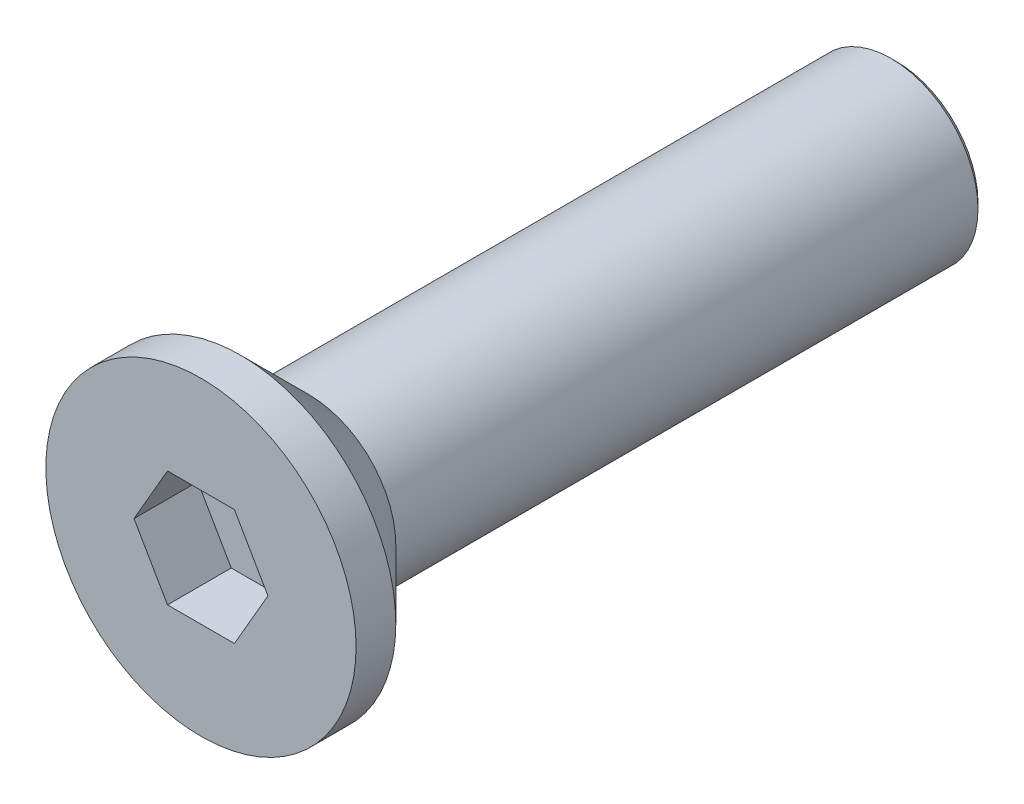
ISO-10303-21;
HEADER;
FILE_DESCRIPTION(('STEP AP214'),'2;1');
FILE_NAME('part.step','',(''),(''),'','','');
FILE_SCHEMA(('AUTOMOTIVE_DESIGN { 1 0 10303 214 1 1 1 1 }'));
ENDSEC;
DATA;
#1=APPLICATION_CONTEXT('core data for automotive mechanical design processes');
#2=APPLICATION_PROTOCOL_DEFINITION('international standard','automotive_design',2000,#1);
#3=PRODUCT_CONTEXT('',#1,'mechanical');
#4=PRODUCT('Part','Part','',(#3));
#5=PRODUCT_RELATED_PRODUCT_CATEGORY('part','',(#4));
#6=PRODUCT_DEFINITION_FORMATION('','',#4);
#7=PRODUCT_DEFINITION_CONTEXT('part definition',#1,'design');
#8=PRODUCT_DEFINITION('design','',#6,#7);
#9=PRODUCT_DEFINITION_SHAPE('','',#8);
#10=(LENGTH_UNIT() NAMED_UNIT(*) SI_UNIT(.MILLI.,.METRE.));
#11=(NAMED_UNIT(*) PLANE_ANGLE_UNIT() SI_UNIT($,.RADIAN.));
#12=(NAMED_UNIT(*) SI_UNIT($,.STERADIAN.) SOLID_ANGLE_UNIT());
#13=UNCERTAINTY_MEASURE_WITH_UNIT(LENGTH_MEASURE(1.E-05),#10,'distance_accuracy_value','');
#14=(GEOMETRIC_REPRESENTATION_CONTEXT(3) GLOBAL_UNCERTAINTY_ASSIGNED_CONTEXT((#13)) GLOBAL_UNIT_ASSIGNED_CONTEXT((#10,
#11,#12)) REPRESENTATION_CONTEXT('',''));
#15=CARTESIAN_POINT('',(0.,0.,0.));
#16=DIRECTION('',(0.,0.,1.));
#17=DIRECTION('',(1.,0.,0.));
#18=AXIS2_PLACEMENT_3D('',#15,#16,#17);
#19=CARTESIAN_POINT('',(0.,0.,0.));
#20=DIRECTION('',(0.,0.,1.));
#21=DIRECTION('',(1.,0.,0.));
#22=AXIS2_PLACEMENT_3D('',#19,#20,#21);
#23=CONICAL_SURFACE('',#22,1.5,0.78539816339745);
#24=CARTESIAN_POINT('',(0.,0.,1.175));
#25=DIRECTION('',(0.,0.,1.));
#26=DIRECTION('',(1.,0.,0.));
#27=AXIS2_PLACEMENT_3D('',#24,#25,#26);
#28=CIRCLE('',#27,2.675);
#29=CARTESIAN_POINT('',(2.675,0.,1.175));
#30=VERTEX_POINT('',#29);
#31=EDGE_CURVE('E11',#30,#30,#28,.T.);
#32=ORIENTED_EDGE('',*,*,#31,.F.);
#33=EDGE_LOOP('',(#32));
#34=FACE_BOUND('',#33,.T.);
#35=CARTESIAN_POINT('',(0.,0.,0.));
#36=DIRECTION('',(0.,0.,1.));
#37=DIRECTION('',(1.,0.,0.));
#38=AXIS2_PLACEMENT_3D('',#35,#36,#37);
#39=CIRCLE('',#38,1.5);
#40=CARTESIAN_POINT('',(1.5,0.,0.));
#41=VERTEX_POINT('',#40);
#42=EDGE_CURVE('E135',#41,#41,#39,.T.);
#43=ORIENTED_EDGE('',*,*,#42,.T.);
#44=EDGE_LOOP('',(#43));
#45=FACE_BOUND('',#44,.T.);
#46=ADVANCED_FACE('F34',(#34,#45),#23,.T.);
#47=CARTESIAN_POINT('',(0.,0.,0.));
#48=DIRECTION('',(0.,0.,1.));
#49=DIRECTION('',(1.,0.,0.));
#50=AXIS2_PLACEMENT_3D('',#47,#48,#49);
#51=CYLINDRICAL_SURFACE('',#50,2.675);
#52=CARTESIAN_POINT('',(0.,0.,1.85999999999999));
#53=DIRECTION('',(0.,0.,1.));
#54=DIRECTION('',(1.,0.,0.));
#55=AXIS2_PLACEMENT_3D('',#52,#53,#54);
#56=CIRCLE('',#55,2.675);
#57=CARTESIAN_POINT('',(2.675,0.,1.85999999999999));
#58=VERTEX_POINT('',#57);
#59=EDGE_CURVE('E41',#58,#58,#56,.T.);
#60=ORIENTED_EDGE('',*,*,#59,.F.);
#61=EDGE_LOOP('',(#60));
#62=FACE_BOUND('',#61,.T.);
#63=ORIENTED_EDGE('',*,*,#31,.T.);
#64=EDGE_LOOP('',(#63));
#65=FACE_BOUND('',#64,.T.);
#66=ADVANCED_FACE('F153',(#62,#65),#51,.T.);
#67=CARTESIAN_POINT('',(0.,0.,1.85999999999999));
#68=DIRECTION('',(0.,0.,-1.));
#69=DIRECTION('',(-1.,0.,0.));
#70=AXIS2_PLACEMENT_3D('',#67,#68,#69);
#71=PLANE('',#70);
#72=DIRECTION('',(-0.500000000000001,0.866025403784438,0.));
#73=VECTOR('',#72,1.);
#74=CARTESIAN_POINT('',(1.15470053837925,0.,1.85999999999999));
#75=LINE('',#74,#73);
#76=CARTESIAN_POINT('',(1.15470053837925,0.,1.85999999999999));
#77=VERTEX_POINT('',#76);
#78=CARTESIAN_POINT('',(0.577350269189623,1.,1.85999999999999));
#79=VERTEX_POINT('',#78);
#80=EDGE_CURVE('E122',#77,#79,#75,.T.);
#81=ORIENTED_EDGE('',*,*,#80,.F.);
#82=DIRECTION('',(0.5,0.866025403784439,0.));
#83=VECTOR('',#82,1.);
#84=CARTESIAN_POINT('',(0.577350269189625,-1.,1.85999999999999));
#85=LINE('',#84,#83);
#86=CARTESIAN_POINT('',(0.577350269189625,-1.,1.85999999999999));
#87=VERTEX_POINT('',#86);
#88=EDGE_CURVE('E48',#87,#77,#85,.T.);
#89=ORIENTED_EDGE('',*,*,#88,.F.);
#90=DIRECTION('',(1.,0.,0.));
#91=VECTOR('',#90,1.);
#92=CARTESIAN_POINT('',(-0.577350269189627,-1.,1.85999999999999));
#93=LINE('',#92,#91);
#94=CARTESIAN_POINT('',(-0.577350269189627,-1.,1.85999999999999));
#95=VERTEX_POINT('',#94);
#96=EDGE_CURVE('E131',#95,#87,#93,.T.);
#97=ORIENTED_EDGE('',*,*,#96,.F.);
#98=DIRECTION('',(0.500000000000001,-0.866025403784438,0.));
#99=VECTOR('',#98,1.);
#100=CARTESIAN_POINT('',(-1.15470053837926,0.,1.85999999999999));
#101=LINE('',#100,#99);
#102=CARTESIAN_POINT('',(-1.15470053837926,0.,1.85999999999999));
#103=VERTEX_POINT('',#102);
#104=EDGE_CURVE('E129',#103,#95,#101,.T.);
#105=ORIENTED_EDGE('',*,*,#104,.F.);
#106=DIRECTION('',(-0.5,-0.866025403784439,0.));
#107=VECTOR('',#106,1.);
#108=CARTESIAN_POINT('',(-0.577350269189627,1.,1.85999999999999));
#109=LINE('',#108,#107);
#110=CARTESIAN_POINT('',(-0.577350269189627,1.,1.85999999999999));
#111=VERTEX_POINT('',#110);
#112=EDGE_CURVE('E96',#111,#103,#109,.T.);
#113=ORIENTED_EDGE('',*,*,#112,.F.);
#114=DIRECTION('',(-1.,0.,0.));
#115=VECTOR('',#114,1.);
#116=CARTESIAN_POINT('',(0.577350269189623,1.,1.85999999999999));
#117=LINE('',#116,#115);
#118=EDGE_CURVE('E125',#79,#111,#117,.T.);
#119=ORIENTED_EDGE('',*,*,#118,.F.);
#120=EDGE_LOOP('',(#81,#89,#97,#105,#113,#119));
#121=FACE_BOUND('',#120,.T.);
#122=ORIENTED_EDGE('',*,*,#59,.T.);
#123=EDGE_LOOP('',(#122));
#124=FACE_BOUND('',#123,.T.);
#125=ADVANCED_FACE('F151',(#121,#124),#71,.F.);
#126=CARTESIAN_POINT('',(0.,1.4,-10.14));
#127=DIRECTION('',(0.,0.,1.));
#128=DIRECTION('',(1.,0.,0.));
#129=AXIS2_PLACEMENT_3D('',#126,#127,#128);
#130=PLANE('',#129);
#131=CARTESIAN_POINT('',(0.,0.,-10.14));
#132=DIRECTION('',(0.,0.,1.));
#133=DIRECTION('',(1.,0.,0.));
#134=AXIS2_PLACEMENT_3D('',#131,#132,#133);
#135=CIRCLE('',#134,1.4);
#136=CARTESIAN_POINT('',(1.4,0.,-10.14));
#137=VERTEX_POINT('',#136);
#138=EDGE_CURVE('E146',#137,#137,#135,.T.);
#139=ORIENTED_EDGE('',*,*,#138,.F.);
#140=EDGE_LOOP('',(#139));
#141=FACE_BOUND('',#140,.T.);
#142=ADVANCED_FACE('F172',(#141),#130,.F.);
#143=CARTESIAN_POINT('',(0.,0.,-10.14));
#144=DIRECTION('',(0.,0.,1.));
#145=DIRECTION('',(1.,0.,0.));
#146=AXIS2_PLACEMENT_3D('',#143,#144,#145);
#147=CONICAL_SURFACE('',#146,1.4,0.785398163397446);
#148=CARTESIAN_POINT('',(0.,0.,-10.04));
#149=DIRECTION('',(0.,0.,1.));
#150=DIRECTION('',(1.,0.,0.));
#151=AXIS2_PLACEMENT_3D('',#148,#149,#150);
#152=CIRCLE('',#151,1.5);
#153=CARTESIAN_POINT('',(1.5,0.,-10.04));
#154=VERTEX_POINT('',#153);
#155=EDGE_CURVE('E143',#154,#154,#152,.T.);
#156=ORIENTED_EDGE('',*,*,#155,.F.);
#157=EDGE_LOOP('',(#156));
#158=FACE_BOUND('',#157,.T.);
#159=ORIENTED_EDGE('',*,*,#138,.T.);
#160=EDGE_LOOP('',(#159));
#161=FACE_BOUND('',#160,.T.);
#162=ADVANCED_FACE('F166',(#158,#161),#147,.T.);
#163=CARTESIAN_POINT('',(0.,0.,0.));
#164=DIRECTION('',(0.,0.,1.));
#165=DIRECTION('',(1.,0.,0.));
#166=AXIS2_PLACEMENT_3D('',#163,#164,#165);
#167=CYLINDRICAL_SURFACE('',#166,1.5);
#168=ORIENTED_EDGE('',*,*,#42,.F.);
#169=EDGE_LOOP('',(#168));
#170=FACE_BOUND('',#169,.T.);
#171=ORIENTED_EDGE('',*,*,#155,.T.);
#172=EDGE_LOOP('',(#171));
#173=FACE_BOUND('',#172,.T.);
#174=ADVANCED_FACE('F162',(#170,#173),#167,.T.);
#175=CARTESIAN_POINT('',(0.577350269189625,-1.,0.759999999999994));
#176=DIRECTION('',(0.866025403784439,-0.5,0.));
#177=DIRECTION('',(0.5,0.866025403784439,0.));
#178=AXIS2_PLACEMENT_3D('',#175,#176,#177);
#179=PLANE('',#178);
#180=ORIENTED_EDGE('',*,*,#88,.T.);
#181=DIRECTION('',(0.,0.,1.));
#182=VECTOR('',#181,1.);
#183=CARTESIAN_POINT('',(1.15470053837925,0.,0.759999999999994));
#184=LINE('',#183,#182);
#185=CARTESIAN_POINT('',(1.15470053837925,0.,0.759999999999994));
#186=VERTEX_POINT('',#185);
#187=EDGE_CURVE('E78',#186,#77,#184,.T.);
#188=ORIENTED_EDGE('',*,*,#187,.F.);
#189=DIRECTION('',(0.5,0.866025403784439,0.));
#190=VECTOR('',#189,1.);
#191=CARTESIAN_POINT('',(0.577350269189625,-1.,0.759999999999994));
#192=LINE('',#191,#190);
#193=CARTESIAN_POINT('',(0.577350269189625,-1.,0.759999999999994));
#194=VERTEX_POINT('',#193);
#195=EDGE_CURVE('E133',#194,#186,#192,.T.);
#196=ORIENTED_EDGE('',*,*,#195,.F.);
#197=DIRECTION('',(0.,0.,1.));
#198=VECTOR('',#197,1.);
#199=CARTESIAN_POINT('',(0.577350269189625,-1.,0.759999999999994));
#200=LINE('',#199,#198);
#201=EDGE_CURVE('E56',#194,#87,#200,.T.);
#202=ORIENTED_EDGE('',*,*,#201,.T.);
#203=EDGE_LOOP('',(#180,#188,#196,#202));
#204=FACE_BOUND('',#203,.T.);
#205=ADVANCED_FACE('F165',(#204),#179,.F.);
#206=CARTESIAN_POINT('',(-0.577350269189627,-1.,0.759999999999994));
#207=DIRECTION('',(0.,-1.,0.));
#208=DIRECTION('',(1.,0.,0.));
#209=AXIS2_PLACEMENT_3D('',#206,#207,#208);
#210=PLANE('',#209);
#211=ORIENTED_EDGE('',*,*,#96,.T.);
#212=ORIENTED_EDGE('',*,*,#201,.F.);
#213=DIRECTION('',(1.,0.,0.));
#214=VECTOR('',#213,1.);
#215=CARTESIAN_POINT('',(-0.577350269189627,-1.,0.759999999999994));
#216=LINE('',#215,#214);
#217=CARTESIAN_POINT('',(-0.577350269189627,-1.,0.759999999999994));
#218=VERTEX_POINT('',#217);
#219=EDGE_CURVE('E108',#218,#194,#216,.T.);
#220=ORIENTED_EDGE('',*,*,#219,.F.);
#221=DIRECTION('',(0.,0.,1.));
#222=VECTOR('',#221,1.);
#223=CARTESIAN_POINT('',(-0.577350269189627,-1.,0.759999999999994));
#224=LINE('',#223,#222);
#225=EDGE_CURVE('E100',#218,#95,#224,.T.);
#226=ORIENTED_EDGE('',*,*,#225,.T.);
#227=EDGE_LOOP('',(#211,#212,#220,#226));
#228=FACE_BOUND('',#227,.T.);
#229=ADVANCED_FACE('F186',(#228),#210,.F.);
#230=CARTESIAN_POINT('',(-1.15470053837926,0.,0.759999999999994));
#231=DIRECTION('',(-0.866025403784438,-0.500000000000001,0.));
#232=DIRECTION('',(0.500000000000001,-0.866025403784438,0.));
#233=AXIS2_PLACEMENT_3D('',#230,#231,#232);
#234=PLANE('',#233);
#235=ORIENTED_EDGE('',*,*,#104,.T.);
#236=ORIENTED_EDGE('',*,*,#225,.F.);
#237=DIRECTION('',(0.500000000000001,-0.866025403784438,0.));
#238=VECTOR('',#237,1.);
#239=CARTESIAN_POINT('',(-1.15470053837926,0.,0.759999999999994));
#240=LINE('',#239,#238);
#241=CARTESIAN_POINT('',(-1.15470053837926,0.,0.759999999999994));
#242=VERTEX_POINT('',#241);
#243=EDGE_CURVE('E104',#242,#218,#240,.T.);
#244=ORIENTED_EDGE('',*,*,#243,.F.);
#245=DIRECTION('',(0.,0.,1.));
#246=VECTOR('',#245,1.);
#247=CARTESIAN_POINT('',(-1.15470053837926,0.,0.759999999999994));
#248=LINE('',#247,#246);
#249=EDGE_CURVE('E89',#242,#103,#248,.T.);
#250=ORIENTED_EDGE('',*,*,#249,.T.);
#251=EDGE_LOOP('',(#235,#236,#244,#250));
#252=FACE_BOUND('',#251,.T.);
#253=ADVANCED_FACE('F105',(#252),#234,.F.);
#254=CARTESIAN_POINT('',(-0.577350269189627,1.,0.759999999999994));
#255=DIRECTION('',(-0.866025403784439,0.5,0.));
#256=DIRECTION('',(-0.5,-0.866025403784439,0.));
#257=AXIS2_PLACEMENT_3D('',#254,#255,#256);
#258=PLANE('',#257);
#259=ORIENTED_EDGE('',*,*,#112,.T.);
#260=ORIENTED_EDGE('',*,*,#249,.F.);
#261=DIRECTION('',(-0.5,-0.866025403784439,0.));
#262=VECTOR('',#261,1.);
#263=CARTESIAN_POINT('',(-0.577350269189627,1.,0.759999999999994));
#264=LINE('',#263,#262);
#265=CARTESIAN_POINT('',(-0.577350269189627,1.,0.759999999999994));
#266=VERTEX_POINT('',#265);
#267=EDGE_CURVE('E93',#266,#242,#264,.T.);
#268=ORIENTED_EDGE('',*,*,#267,.F.);
#269=DIRECTION('',(0.,0.,1.));
#270=VECTOR('',#269,1.);
#271=CARTESIAN_POINT('',(-0.577350269189627,1.,0.759999999999994));
#272=LINE('',#271,#270);
#273=EDGE_CURVE('E101',#266,#111,#272,.T.);
#274=ORIENTED_EDGE('',*,*,#273,.T.);
#275=EDGE_LOOP('',(#259,#260,#268,#274));
#276=FACE_BOUND('',#275,.T.);
#277=ADVANCED_FACE('F91',(#276),#258,.F.);
#278=CARTESIAN_POINT('',(0.577350269189623,1.,0.759999999999994));
#279=DIRECTION('',(0.,1.,0.));
#280=DIRECTION('',(-1.,0.,0.));
#281=AXIS2_PLACEMENT_3D('',#278,#279,#280);
#282=PLANE('',#281);
#283=ORIENTED_EDGE('',*,*,#118,.T.);
#284=ORIENTED_EDGE('',*,*,#273,.F.);
#285=DIRECTION('',(-1.,0.,0.));
#286=VECTOR('',#285,1.);
#287=CARTESIAN_POINT('',(0.577350269189623,1.,0.759999999999994));
#288=LINE('',#287,#286);
#289=CARTESIAN_POINT('',(0.577350269189623,1.,0.759999999999994));
#290=VERTEX_POINT('',#289);
#291=EDGE_CURVE('E114',#290,#266,#288,.T.);
#292=ORIENTED_EDGE('',*,*,#291,.F.);
#293=DIRECTION('',(0.,0.,1.));
#294=VECTOR('',#293,1.);
#295=CARTESIAN_POINT('',(0.577350269189623,1.,0.759999999999994));
#296=LINE('',#295,#294);
#297=EDGE_CURVE('E138',#290,#79,#296,.T.);
#298=ORIENTED_EDGE('',*,*,#297,.T.);
#299=EDGE_LOOP('',(#283,#284,#292,#298));
#300=FACE_BOUND('',#299,.T.);
#301=ADVANCED_FACE('F190',(#300),#282,.F.);
#302=CARTESIAN_POINT('',(1.15470053837925,0.,0.759999999999994));
#303=DIRECTION('',(0.866025403784438,0.500000000000001,0.));
#304=DIRECTION('',(-0.500000000000001,0.866025403784438,0.));
#305=AXIS2_PLACEMENT_3D('',#302,#303,#304);
#306=PLANE('',#305);
#307=ORIENTED_EDGE('',*,*,#80,.T.);
#308=ORIENTED_EDGE('',*,*,#297,.F.);
#309=DIRECTION('',(-0.500000000000001,0.866025403784438,0.));
#310=VECTOR('',#309,1.);
#311=CARTESIAN_POINT('',(1.15470053837925,0.,0.759999999999994));
#312=LINE('',#311,#310);
#313=EDGE_CURVE('E116',#186,#290,#312,.T.);
#314=ORIENTED_EDGE('',*,*,#313,.F.);
#315=ORIENTED_EDGE('',*,*,#187,.T.);
#316=EDGE_LOOP('',(#307,#308,#314,#315));
#317=FACE_BOUND('',#316,.T.);
#318=ADVANCED_FACE('F187',(#317),#306,.F.);
#319=CARTESIAN_POINT('',(1.15470053837925,0.,0.759999999999994));
#320=DIRECTION('',(0.,0.,1.));
#321=DIRECTION('',(1.,0.,0.));
#322=AXIS2_PLACEMENT_3D('',#319,#320,#321);
#323=PLANE('',#322);
#324=ORIENTED_EDGE('',*,*,#195,.T.);
#325=ORIENTED_EDGE('',*,*,#313,.T.);
#326=ORIENTED_EDGE('',*,*,#291,.T.);
#327=ORIENTED_EDGE('',*,*,#267,.T.);
#328=ORIENTED_EDGE('',*,*,#243,.T.);
#329=ORIENTED_EDGE('',*,*,#219,.T.);
#330=EDGE_LOOP('',(#324,#325,#326,#327,#328,#329));
#331=FACE_BOUND('',#330,.T.);
#332=ADVANCED_FACE('F111',(#331),#323,.T.);
#333=CLOSED_SHELL('',(#46,#66,#125,#142,#162,#174,#205,#229,#253,#277,#301,#318,#332));
#334=MANIFOLD_SOLID_BREP('B2',#333);
#335=ADVANCED_BREP_SHAPE_REPRESENTATION('',(#18,#334),#14);
#336=SHAPE_DEFINITION_REPRESENTATION(#9,#335);
ENDSEC;
END-ISO-10303-21;
